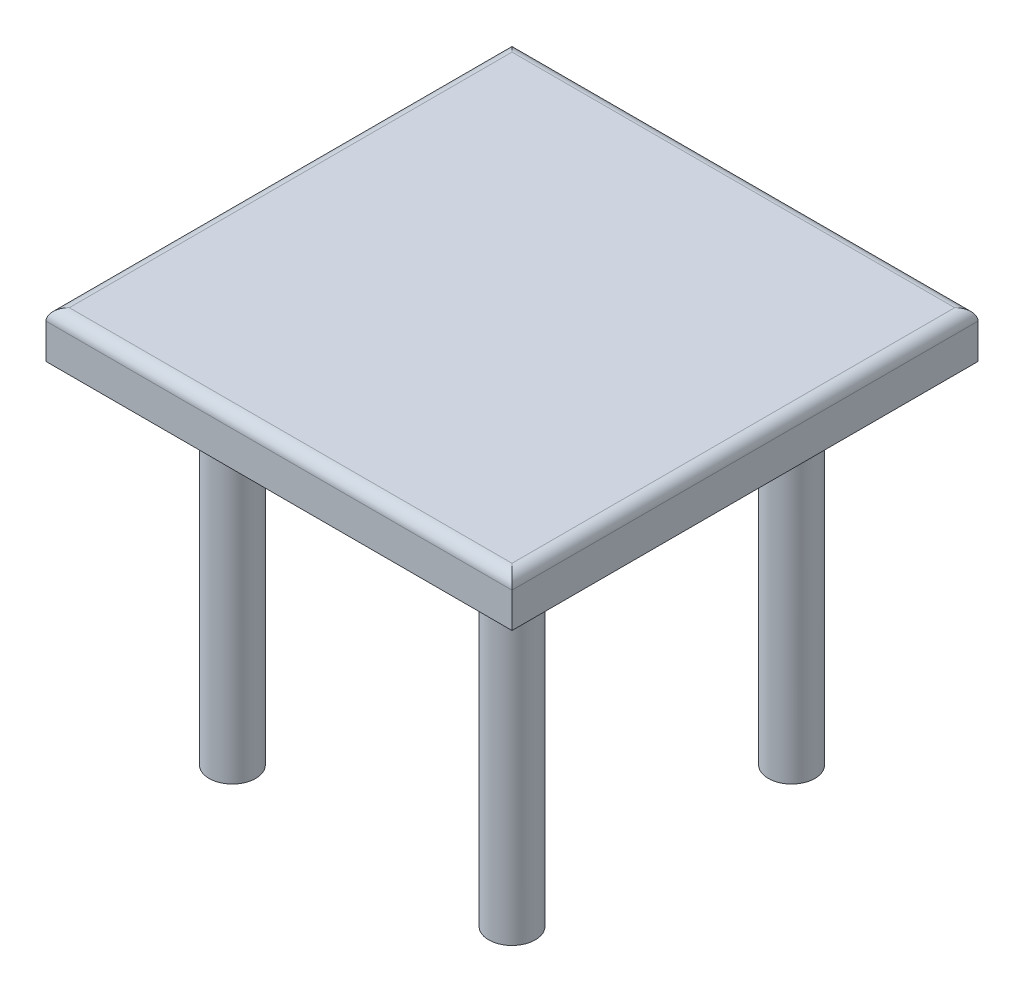
ISO-10303-21;
HEADER;
FILE_DESCRIPTION(('STEP AP214'),'2;1');
FILE_NAME('part.step','',(''),(''),'','','');
FILE_SCHEMA(('AUTOMOTIVE_DESIGN { 1 0 10303 214 1 1 1 1 }'));
ENDSEC;
DATA;
#1=APPLICATION_CONTEXT('core data for automotive mechanical design processes');
#2=APPLICATION_PROTOCOL_DEFINITION('international standard','automotive_design',2000,#1);
#3=PRODUCT_CONTEXT('',#1,'mechanical');
#4=PRODUCT('Part','Part','',(#3));
#5=PRODUCT_RELATED_PRODUCT_CATEGORY('part','',(#4));
#6=PRODUCT_DEFINITION_FORMATION('','',#4);
#7=PRODUCT_DEFINITION_CONTEXT('part definition',#1,'design');
#8=PRODUCT_DEFINITION('design','',#6,#7);
#9=PRODUCT_DEFINITION_SHAPE('','',#8);
#10=(LENGTH_UNIT() NAMED_UNIT(*) SI_UNIT(.MILLI.,.METRE.));
#11=(NAMED_UNIT(*) PLANE_ANGLE_UNIT() SI_UNIT($,.RADIAN.));
#12=(NAMED_UNIT(*) SI_UNIT($,.STERADIAN.) SOLID_ANGLE_UNIT());
#13=UNCERTAINTY_MEASURE_WITH_UNIT(LENGTH_MEASURE(1.E-05),#10,'distance_accuracy_value','');
#14=(GEOMETRIC_REPRESENTATION_CONTEXT(3) GLOBAL_UNCERTAINTY_ASSIGNED_CONTEXT((#13)) GLOBAL_UNIT_ASSIGNED_CONTEXT((#10,
#11,#12)) REPRESENTATION_CONTEXT('',''));
#15=CARTESIAN_POINT('',(0.,0.,0.));
#16=DIRECTION('',(0.,0.,1.));
#17=DIRECTION('',(1.,0.,0.));
#18=AXIS2_PLACEMENT_3D('',#15,#16,#17);
#19=CARTESIAN_POINT('',(-100.,-20.,100.));
#20=DIRECTION('',(-1.,0.,0.));
#21=DIRECTION('',(0.,0.,1.));
#22=AXIS2_PLACEMENT_3D('',#19,#20,#21);
#23=PLANE('',#22);
#24=DIRECTION('',(0.,1.,0.));
#25=VECTOR('',#24,1.);
#26=CARTESIAN_POINT('',(-100.,-20.,100.));
#27=LINE('',#26,#25);
#28=CARTESIAN_POINT('',(-100.,-20.,100.));
#29=VERTEX_POINT('',#28);
#30=CARTESIAN_POINT('',(-100.,-5.,100.));
#31=VERTEX_POINT('',#30);
#32=EDGE_CURVE('E107',#29,#31,#27,.T.);
#33=ORIENTED_EDGE('',*,*,#32,.T.);
#34=DIRECTION('',(0.,0.,1.));
#35=VECTOR('',#34,1.);
#36=CARTESIAN_POINT('',(-100.,-5.,-100.));
#37=LINE('',#36,#35);
#38=CARTESIAN_POINT('',(-100.,-5.,-100.));
#39=VERTEX_POINT('',#38);
#40=EDGE_CURVE('E169',#31,#39,#37,.F.);
#41=ORIENTED_EDGE('',*,*,#40,.T.);
#42=DIRECTION('',(0.,1.,0.));
#43=VECTOR('',#42,1.);
#44=CARTESIAN_POINT('',(-100.,-20.,-100.));
#45=LINE('',#44,#43);
#46=CARTESIAN_POINT('',(-100.,-20.,-100.));
#47=VERTEX_POINT('',#46);
#48=EDGE_CURVE('E132',#47,#39,#45,.T.);
#49=ORIENTED_EDGE('',*,*,#48,.F.);
#50=DIRECTION('',(0.,0.,1.));
#51=VECTOR('',#50,1.);
#52=CARTESIAN_POINT('',(-100.,-20.,100.));
#53=LINE('',#52,#51);
#54=EDGE_CURVE('E126',#47,#29,#53,.T.);
#55=ORIENTED_EDGE('',*,*,#54,.T.);
#56=EDGE_LOOP('',(#33,#41,#49,#55));
#57=FACE_BOUND('',#56,.T.);
#58=ADVANCED_FACE('F51',(#57),#23,.T.);
#59=CARTESIAN_POINT('',(-100.,-20.,-100.));
#60=DIRECTION('',(0.,0.,-1.));
#61=DIRECTION('',(-1.,0.,0.));
#62=AXIS2_PLACEMENT_3D('',#59,#60,#61);
#63=PLANE('',#62);
#64=ORIENTED_EDGE('',*,*,#48,.T.);
#65=DIRECTION('',(-1.,0.,0.));
#66=VECTOR('',#65,1.);
#67=CARTESIAN_POINT('',(100.,-5.,-100.));
#68=LINE('',#67,#66);
#69=CARTESIAN_POINT('',(100.,-5.,-100.));
#70=VERTEX_POINT('',#69);
#71=EDGE_CURVE('E68',#39,#70,#68,.F.);
#72=ORIENTED_EDGE('',*,*,#71,.T.);
#73=DIRECTION('',(0.,1.,0.));
#74=VECTOR('',#73,1.);
#75=CARTESIAN_POINT('',(100.,-20.,-100.));
#76=LINE('',#75,#74);
#77=CARTESIAN_POINT('',(100.,-20.,-100.));
#78=VERTEX_POINT('',#77);
#79=EDGE_CURVE('E153',#78,#70,#76,.T.);
#80=ORIENTED_EDGE('',*,*,#79,.F.);
#81=DIRECTION('',(-1.,0.,0.));
#82=VECTOR('',#81,1.);
#83=CARTESIAN_POINT('',(-100.,-20.,-100.));
#84=LINE('',#83,#82);
#85=EDGE_CURVE('E119',#78,#47,#84,.T.);
#86=ORIENTED_EDGE('',*,*,#85,.T.);
#87=EDGE_LOOP('',(#64,#72,#80,#86));
#88=FACE_BOUND('',#87,.T.);
#89=ADVANCED_FACE('F227',(#88),#63,.T.);
#90=CARTESIAN_POINT('',(100.,-20.,-100.));
#91=DIRECTION('',(1.,0.,0.));
#92=DIRECTION('',(0.,0.,-1.));
#93=AXIS2_PLACEMENT_3D('',#90,#91,#92);
#94=PLANE('',#93);
#95=ORIENTED_EDGE('',*,*,#79,.T.);
#96=DIRECTION('',(0.,0.,-1.));
#97=VECTOR('',#96,1.);
#98=CARTESIAN_POINT('',(100.,-5.,100.));
#99=LINE('',#98,#97);
#100=CARTESIAN_POINT('',(100.,-5.,100.));
#101=VERTEX_POINT('',#100);
#102=EDGE_CURVE('E75',#70,#101,#99,.F.);
#103=ORIENTED_EDGE('',*,*,#102,.T.);
#104=DIRECTION('',(0.,1.,0.));
#105=VECTOR('',#104,1.);
#106=CARTESIAN_POINT('',(100.,-20.,100.));
#107=LINE('',#106,#105);
#108=CARTESIAN_POINT('',(100.,-20.,100.));
#109=VERTEX_POINT('',#108);
#110=EDGE_CURVE('E118',#109,#101,#107,.T.);
#111=ORIENTED_EDGE('',*,*,#110,.F.);
#112=DIRECTION('',(0.,0.,-1.));
#113=VECTOR('',#112,1.);
#114=CARTESIAN_POINT('',(100.,-20.,-100.));
#115=LINE('',#114,#113);
#116=EDGE_CURVE('E129',#109,#78,#115,.T.);
#117=ORIENTED_EDGE('',*,*,#116,.T.);
#118=EDGE_LOOP('',(#95,#103,#111,#117));
#119=FACE_BOUND('',#118,.T.);
#120=ADVANCED_FACE('F231',(#119),#94,.T.);
#121=CARTESIAN_POINT('',(100.,-20.,100.));
#122=DIRECTION('',(0.,0.,1.));
#123=DIRECTION('',(1.,0.,0.));
#124=AXIS2_PLACEMENT_3D('',#121,#122,#123);
#125=PLANE('',#124);
#126=ORIENTED_EDGE('',*,*,#110,.T.);
#127=DIRECTION('',(1.,0.,0.));
#128=VECTOR('',#127,1.);
#129=CARTESIAN_POINT('',(-100.,-5.,100.));
#130=LINE('',#129,#128);
#131=EDGE_CURVE('E112',#101,#31,#130,.F.);
#132=ORIENTED_EDGE('',*,*,#131,.T.);
#133=ORIENTED_EDGE('',*,*,#32,.F.);
#134=DIRECTION('',(1.,0.,0.));
#135=VECTOR('',#134,1.);
#136=CARTESIAN_POINT('',(100.,-20.,100.));
#137=LINE('',#136,#135);
#138=EDGE_CURVE('E110',#29,#109,#137,.T.);
#139=ORIENTED_EDGE('',*,*,#138,.T.);
#140=EDGE_LOOP('',(#126,#132,#133,#139));
#141=FACE_BOUND('',#140,.T.);
#142=ADVANCED_FACE('F109',(#141),#125,.T.);
#143=CARTESIAN_POINT('',(0.,-20.,0.));
#144=DIRECTION('',(0.,-1.,0.));
#145=DIRECTION('',(0.,0.,-1.));
#146=AXIS2_PLACEMENT_3D('',#143,#144,#145);
#147=PLANE('',#146);
#148=CARTESIAN_POINT('',(60.,-20.,-60.));
#149=DIRECTION('',(0.,-1.,0.));
#150=DIRECTION('',(0.,0.,-1.));
#151=AXIS2_PLACEMENT_3D('',#148,#149,#150);
#152=CIRCLE('',#151,9.99999999999999);
#153=CARTESIAN_POINT('',(60.,-20.,-70.));
#154=VERTEX_POINT('',#153);
#155=EDGE_CURVE('E11',#154,#154,#152,.T.);
#156=ORIENTED_EDGE('',*,*,#155,.F.);
#157=EDGE_LOOP('',(#156));
#158=FACE_BOUND('',#157,.T.);
#159=CARTESIAN_POINT('',(-60.,-20.,60.));
#160=DIRECTION('',(0.,-1.,0.));
#161=DIRECTION('',(0.,0.,-1.));
#162=AXIS2_PLACEMENT_3D('',#159,#160,#161);
#163=CIRCLE('',#162,10.);
#164=CARTESIAN_POINT('',(-60.,-20.,50.));
#165=VERTEX_POINT('',#164);
#166=EDGE_CURVE('E61',#165,#165,#163,.T.);
#167=ORIENTED_EDGE('',*,*,#166,.F.);
#168=EDGE_LOOP('',(#167));
#169=FACE_BOUND('',#168,.T.);
#170=CARTESIAN_POINT('',(60.,-20.,60.));
#171=DIRECTION('',(0.,-1.,0.));
#172=DIRECTION('',(0.,0.,-1.));
#173=AXIS2_PLACEMENT_3D('',#170,#171,#172);
#174=CIRCLE('',#173,9.99999999999999);
#175=CARTESIAN_POINT('',(60.,-20.,50.));
#176=VERTEX_POINT('',#175);
#177=EDGE_CURVE('E190',#176,#176,#174,.T.);
#178=ORIENTED_EDGE('',*,*,#177,.F.);
#179=EDGE_LOOP('',(#178));
#180=FACE_BOUND('',#179,.T.);
#181=CARTESIAN_POINT('',(-60.,-20.,-60.));
#182=DIRECTION('',(0.,-1.,0.));
#183=DIRECTION('',(0.,0.,-1.));
#184=AXIS2_PLACEMENT_3D('',#181,#182,#183);
#185=CIRCLE('',#184,10.);
#186=CARTESIAN_POINT('',(-60.,-20.,-70.));
#187=VERTEX_POINT('',#186);
#188=EDGE_CURVE('E178',#187,#187,#185,.T.);
#189=ORIENTED_EDGE('',*,*,#188,.F.);
#190=EDGE_LOOP('',(#189));
#191=FACE_BOUND('',#190,.T.);
#192=ORIENTED_EDGE('',*,*,#54,.F.);
#193=ORIENTED_EDGE('',*,*,#85,.F.);
#194=ORIENTED_EDGE('',*,*,#116,.F.);
#195=ORIENTED_EDGE('',*,*,#138,.F.);
#196=EDGE_LOOP('',(#192,#193,#194,#195));
#197=FACE_BOUND('',#196,.T.);
#198=ADVANCED_FACE('F124',(#158,#169,#180,#191,#197),#147,.T.);
#199=CARTESIAN_POINT('',(0.,0.,0.));
#200=DIRECTION('',(0.,-1.,0.));
#201=DIRECTION('',(0.,0.,-1.));
#202=AXIS2_PLACEMENT_3D('',#199,#200,#201);
#203=PLANE('',#202);
#204=DIRECTION('',(0.,0.,-1.));
#205=VECTOR('',#204,1.);
#206=CARTESIAN_POINT('',(95.,0.,-100.));
#207=LINE('',#206,#205);
#208=CARTESIAN_POINT('',(95.,0.,95.));
#209=VERTEX_POINT('',#208);
#210=CARTESIAN_POINT('',(95.,0.,-95.));
#211=VERTEX_POINT('',#210);
#212=EDGE_CURVE('E160',#209,#211,#207,.T.);
#213=ORIENTED_EDGE('',*,*,#212,.T.);
#214=DIRECTION('',(-1.,0.,0.));
#215=VECTOR('',#214,1.);
#216=CARTESIAN_POINT('',(-100.,0.,-95.));
#217=LINE('',#216,#215);
#218=CARTESIAN_POINT('',(-95.,0.,-95.));
#219=VERTEX_POINT('',#218);
#220=EDGE_CURVE('E166',#211,#219,#217,.T.);
#221=ORIENTED_EDGE('',*,*,#220,.T.);
#222=DIRECTION('',(0.,0.,1.));
#223=VECTOR('',#222,1.);
#224=CARTESIAN_POINT('',(-95.,0.,100.));
#225=LINE('',#224,#223);
#226=CARTESIAN_POINT('',(-95.,0.,95.));
#227=VERTEX_POINT('',#226);
#228=EDGE_CURVE('E163',#219,#227,#225,.T.);
#229=ORIENTED_EDGE('',*,*,#228,.T.);
#230=DIRECTION('',(1.,0.,0.));
#231=VECTOR('',#230,1.);
#232=CARTESIAN_POINT('',(100.,0.,95.));
#233=LINE('',#232,#231);
#234=EDGE_CURVE('E152',#227,#209,#233,.T.);
#235=ORIENTED_EDGE('',*,*,#234,.T.);
#236=EDGE_LOOP('',(#213,#221,#229,#235));
#237=FACE_BOUND('',#236,.T.);
#238=ADVANCED_FACE('F202',(#237),#203,.F.);
#239=CARTESIAN_POINT('',(95.,-5.,0.));
#240=DIRECTION('',(0.,0.,1.));
#241=DIRECTION('',(1.,0.,0.));
#242=AXIS2_PLACEMENT_3D('',#239,#240,#241);
#243=CYLINDRICAL_SURFACE('',#242,5.);
#244=CARTESIAN_POINT('',(95.,-5.,95.));
#245=DIRECTION('',(-0.707106781186547,0.,0.707106781186547));
#246=DIRECTION('',(-0.707106781186547,0.,-0.707106781186547));
#247=AXIS2_PLACEMENT_3D('',#244,#245,#246);
#248=ELLIPSE('',#247,7.07106781186547,5.);
#249=EDGE_CURVE('E140',#101,#209,#248,.T.);
#250=ORIENTED_EDGE('',*,*,#249,.F.);
#251=ORIENTED_EDGE('',*,*,#102,.F.);
#252=CARTESIAN_POINT('',(95.,-5.,-95.));
#253=DIRECTION('',(0.707106781186547,0.,0.707106781186547));
#254=DIRECTION('',(0.707106781186547,0.,-0.707106781186547));
#255=AXIS2_PLACEMENT_3D('',#252,#253,#254);
#256=ELLIPSE('',#255,7.07106781186547,5.);
#257=EDGE_CURVE('E134',#211,#70,#256,.F.);
#258=ORIENTED_EDGE('',*,*,#257,.F.);
#259=ORIENTED_EDGE('',*,*,#212,.F.);
#260=EDGE_LOOP('',(#250,#251,#258,#259));
#261=FACE_BOUND('',#260,.T.);
#262=ADVANCED_FACE('F54',(#261),#243,.T.);
#263=CARTESIAN_POINT('',(0.,-5.,-95.));
#264=DIRECTION('',(1.,0.,0.));
#265=DIRECTION('',(0.,0.,-1.));
#266=AXIS2_PLACEMENT_3D('',#263,#264,#265);
#267=CYLINDRICAL_SURFACE('',#266,5.);
#268=ORIENTED_EDGE('',*,*,#257,.T.);
#269=ORIENTED_EDGE('',*,*,#71,.F.);
#270=CARTESIAN_POINT('',(-95.,-5.,-95.));
#271=DIRECTION('',(0.707106781186547,0.,-0.707106781186547));
#272=DIRECTION('',(0.707106781186547,0.,0.707106781186547));
#273=AXIS2_PLACEMENT_3D('',#270,#271,#272);
#274=ELLIPSE('',#273,7.07106781186547,5.);
#275=EDGE_CURVE('E182',#219,#39,#274,.F.);
#276=ORIENTED_EDGE('',*,*,#275,.F.);
#277=ORIENTED_EDGE('',*,*,#220,.F.);
#278=EDGE_LOOP('',(#268,#269,#276,#277));
#279=FACE_BOUND('',#278,.T.);
#280=ADVANCED_FACE('F243',(#279),#267,.T.);
#281=CARTESIAN_POINT('',(0.,-5.,95.));
#282=DIRECTION('',(-1.,0.,0.));
#283=DIRECTION('',(0.,0.,1.));
#284=AXIS2_PLACEMENT_3D('',#281,#282,#283);
#285=CYLINDRICAL_SURFACE('',#284,5.);
#286=ORIENTED_EDGE('',*,*,#249,.T.);
#287=ORIENTED_EDGE('',*,*,#234,.F.);
#288=CARTESIAN_POINT('',(-95.,-5.,95.));
#289=DIRECTION('',(-0.707106781186547,0.,-0.707106781186547));
#290=DIRECTION('',(-0.707106781186547,0.,0.707106781186547));
#291=AXIS2_PLACEMENT_3D('',#288,#289,#290);
#292=ELLIPSE('',#291,7.07106781186547,5.);
#293=EDGE_CURVE('E179',#31,#227,#292,.T.);
#294=ORIENTED_EDGE('',*,*,#293,.F.);
#295=ORIENTED_EDGE('',*,*,#131,.F.);
#296=EDGE_LOOP('',(#286,#287,#294,#295));
#297=FACE_BOUND('',#296,.T.);
#298=ADVANCED_FACE('F221',(#297),#285,.T.);
#299=CARTESIAN_POINT('',(-95.,-5.,0.));
#300=DIRECTION('',(0.,0.,-1.));
#301=DIRECTION('',(-1.,0.,0.));
#302=AXIS2_PLACEMENT_3D('',#299,#300,#301);
#303=CYLINDRICAL_SURFACE('',#302,5.);
#304=ORIENTED_EDGE('',*,*,#275,.T.);
#305=ORIENTED_EDGE('',*,*,#40,.F.);
#306=ORIENTED_EDGE('',*,*,#293,.T.);
#307=ORIENTED_EDGE('',*,*,#228,.F.);
#308=EDGE_LOOP('',(#304,#305,#306,#307));
#309=FACE_BOUND('',#308,.T.);
#310=ADVANCED_FACE('F212',(#309),#303,.T.);
#311=CARTESIAN_POINT('',(-60.,-170.,-60.));
#312=DIRECTION('',(0.,1.,0.));
#313=DIRECTION('',(0.,0.,1.));
#314=AXIS2_PLACEMENT_3D('',#311,#312,#313);
#315=CYLINDRICAL_SURFACE('',#314,10.);
#316=CARTESIAN_POINT('',(-60.,-170.,-60.));
#317=DIRECTION('',(0.,1.,0.));
#318=DIRECTION('',(0.,0.,1.));
#319=AXIS2_PLACEMENT_3D('',#316,#317,#318);
#320=CIRCLE('',#319,10.);
#321=CARTESIAN_POINT('',(-60.,-170.,-50.));
#322=VERTEX_POINT('',#321);
#323=EDGE_CURVE('E143',#322,#322,#320,.T.);
#324=ORIENTED_EDGE('',*,*,#323,.T.);
#325=EDGE_LOOP('',(#324));
#326=FACE_BOUND('',#325,.T.);
#327=ORIENTED_EDGE('',*,*,#188,.T.);
#328=EDGE_LOOP('',(#327));
#329=FACE_BOUND('',#328,.T.);
#330=ADVANCED_FACE('F209',(#326,#329),#315,.T.);
#331=CARTESIAN_POINT('',(-60.,-170.,-60.));
#332=DIRECTION('',(0.,1.,0.));
#333=DIRECTION('',(0.,0.,1.));
#334=AXIS2_PLACEMENT_3D('',#331,#332,#333);
#335=PLANE('',#334);
#336=ORIENTED_EDGE('',*,*,#323,.F.);
#337=EDGE_LOOP('',(#336));
#338=FACE_BOUND('',#337,.T.);
#339=ADVANCED_FACE('F211',(#338),#335,.F.);
#340=CARTESIAN_POINT('',(60.,-170.,60.));
#341=DIRECTION('',(0.,1.,0.));
#342=DIRECTION('',(0.,0.,1.));
#343=AXIS2_PLACEMENT_3D('',#340,#341,#342);
#344=CYLINDRICAL_SURFACE('',#343,9.99999999999999);
#345=CARTESIAN_POINT('',(60.,-170.,60.));
#346=DIRECTION('',(0.,1.,0.));
#347=DIRECTION('',(0.,0.,1.));
#348=AXIS2_PLACEMENT_3D('',#345,#346,#347);
#349=CIRCLE('',#348,9.99999999999999);
#350=CARTESIAN_POINT('',(60.,-170.,70.));
#351=VERTEX_POINT('',#350);
#352=EDGE_CURVE('E444',#351,#351,#349,.T.);
#353=ORIENTED_EDGE('',*,*,#352,.T.);
#354=EDGE_LOOP('',(#353));
#355=FACE_BOUND('',#354,.T.);
#356=ORIENTED_EDGE('',*,*,#177,.T.);
#357=EDGE_LOOP('',(#356));
#358=FACE_BOUND('',#357,.T.);
#359=ADVANCED_FACE('F218',(#355,#358),#344,.T.);
#360=CARTESIAN_POINT('',(60.,-170.,60.));
#361=DIRECTION('',(0.,1.,0.));
#362=DIRECTION('',(0.,0.,1.));
#363=AXIS2_PLACEMENT_3D('',#360,#361,#362);
#364=PLANE('',#363);
#365=ORIENTED_EDGE('',*,*,#352,.F.);
#366=EDGE_LOOP('',(#365));
#367=FACE_BOUND('',#366,.T.);
#368=ADVANCED_FACE('F297',(#367),#364,.F.);
#369=CARTESIAN_POINT('',(-60.,-170.,60.));
#370=DIRECTION('',(0.,1.,0.));
#371=DIRECTION('',(0.,0.,1.));
#372=AXIS2_PLACEMENT_3D('',#369,#370,#371);
#373=CYLINDRICAL_SURFACE('',#372,10.);
#374=CARTESIAN_POINT('',(-60.,-170.,60.));
#375=DIRECTION('',(0.,1.,0.));
#376=DIRECTION('',(0.,0.,1.));
#377=AXIS2_PLACEMENT_3D('',#374,#375,#376);
#378=CIRCLE('',#377,10.);
#379=CARTESIAN_POINT('',(-60.,-170.,70.));
#380=VERTEX_POINT('',#379);
#381=EDGE_CURVE('E440',#380,#380,#378,.T.);
#382=ORIENTED_EDGE('',*,*,#381,.T.);
#383=EDGE_LOOP('',(#382));
#384=FACE_BOUND('',#383,.T.);
#385=ORIENTED_EDGE('',*,*,#166,.T.);
#386=EDGE_LOOP('',(#385));
#387=FACE_BOUND('',#386,.T.);
#388=ADVANCED_FACE('F198',(#384,#387),#373,.T.);
#389=CARTESIAN_POINT('',(-60.,-170.,60.));
#390=DIRECTION('',(0.,1.,0.));
#391=DIRECTION('',(0.,0.,1.));
#392=AXIS2_PLACEMENT_3D('',#389,#390,#391);
#393=PLANE('',#392);
#394=ORIENTED_EDGE('',*,*,#381,.F.);
#395=EDGE_LOOP('',(#394));
#396=FACE_BOUND('',#395,.T.);
#397=ADVANCED_FACE('F312',(#396),#393,.F.);
#398=CARTESIAN_POINT('',(60.,-170.,-60.));
#399=DIRECTION('',(0.,1.,0.));
#400=DIRECTION('',(0.,0.,1.));
#401=AXIS2_PLACEMENT_3D('',#398,#399,#400);
#402=CYLINDRICAL_SURFACE('',#401,9.99999999999999);
#403=CARTESIAN_POINT('',(60.,-170.,-60.));
#404=DIRECTION('',(0.,1.,0.));
#405=DIRECTION('',(0.,0.,1.));
#406=AXIS2_PLACEMENT_3D('',#403,#404,#405);
#407=CIRCLE('',#406,9.99999999999999);
#408=CARTESIAN_POINT('',(60.,-170.,-50.));
#409=VERTEX_POINT('',#408);
#410=EDGE_CURVE('E438',#409,#409,#407,.T.);
#411=ORIENTED_EDGE('',*,*,#410,.T.);
#412=EDGE_LOOP('',(#411));
#413=FACE_BOUND('',#412,.T.);
#414=ORIENTED_EDGE('',*,*,#155,.T.);
#415=EDGE_LOOP('',(#414));
#416=FACE_BOUND('',#415,.T.);
#417=ADVANCED_FACE('F320',(#413,#416),#402,.T.);
#418=CARTESIAN_POINT('',(60.,-170.,-60.));
#419=DIRECTION('',(0.,1.,0.));
#420=DIRECTION('',(0.,0.,1.));
#421=AXIS2_PLACEMENT_3D('',#418,#419,#420);
#422=PLANE('',#421);
#423=ORIENTED_EDGE('',*,*,#410,.F.);
#424=EDGE_LOOP('',(#423));
#425=FACE_BOUND('',#424,.T.);
#426=ADVANCED_FACE('F328',(#425),#422,.F.);
#427=CLOSED_SHELL('',(#58,#89,#120,#142,#198,#238,#262,#280,#298,#310,#330,#339,#359,#368,#388,
#397,#417,#426));
#428=MANIFOLD_SOLID_BREP('B2',#427);
#429=ADVANCED_BREP_SHAPE_REPRESENTATION('',(#18,#428),#14);
#430=SHAPE_DEFINITION_REPRESENTATION(#9,#429);
ENDSEC;
END-ISO-10303-21;
